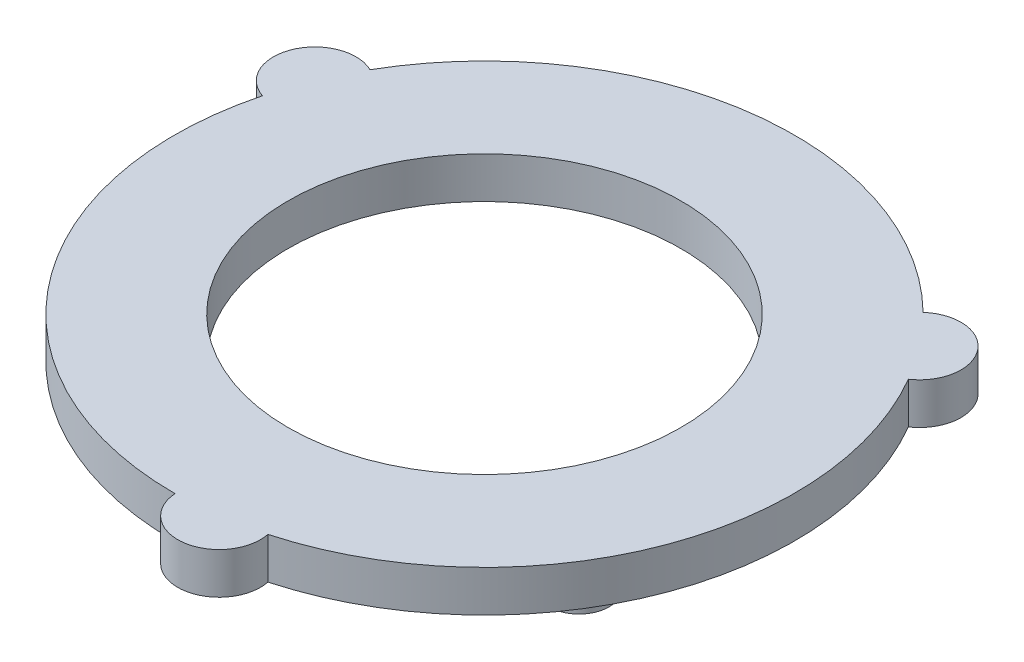
ISO-10303-21;
HEADER;
FILE_DESCRIPTION(('STEP AP214'),'2;1');
FILE_NAME('part.step','',(''),(''),'','','');
FILE_SCHEMA(('AUTOMOTIVE_DESIGN { 1 0 10303 214 1 1 1 1 }'));
ENDSEC;
DATA;
#1=APPLICATION_CONTEXT('core data for automotive mechanical design processes');
#2=APPLICATION_PROTOCOL_DEFINITION('international standard','automotive_design',2000,#1);
#3=PRODUCT_CONTEXT('',#1,'mechanical');
#4=PRODUCT('Part','Part','',(#3));
#5=PRODUCT_RELATED_PRODUCT_CATEGORY('part','',(#4));
#6=PRODUCT_DEFINITION_FORMATION('','',#4);
#7=PRODUCT_DEFINITION_CONTEXT('part definition',#1,'design');
#8=PRODUCT_DEFINITION('design','',#6,#7);
#9=PRODUCT_DEFINITION_SHAPE('','',#8);
#10=(LENGTH_UNIT() NAMED_UNIT(*) SI_UNIT(.MILLI.,.METRE.));
#11=(NAMED_UNIT(*) PLANE_ANGLE_UNIT() SI_UNIT($,.RADIAN.));
#12=(NAMED_UNIT(*) SI_UNIT($,.STERADIAN.) SOLID_ANGLE_UNIT());
#13=UNCERTAINTY_MEASURE_WITH_UNIT(LENGTH_MEASURE(1.E-05),#10,'distance_accuracy_value','');
#14=(GEOMETRIC_REPRESENTATION_CONTEXT(3) GLOBAL_UNCERTAINTY_ASSIGNED_CONTEXT((#13)) GLOBAL_UNIT_ASSIGNED_CONTEXT((#10,
#11,#12)) REPRESENTATION_CONTEXT('',''));
#15=CARTESIAN_POINT('',(0.,0.,0.));
#16=DIRECTION('',(0.,0.,1.));
#17=DIRECTION('',(1.,0.,0.));
#18=AXIS2_PLACEMENT_3D('',#15,#16,#17);
#19=CARTESIAN_POINT('',(0.,4.,0.));
#20=DIRECTION('',(0.,-1.,0.));
#21=DIRECTION('',(0.,0.,-1.));
#22=AXIS2_PLACEMENT_3D('',#19,#20,#21);
#23=CYLINDRICAL_SURFACE('',#22,30.);
#24=CARTESIAN_POINT('',(0.,0.,0.));
#25=DIRECTION('',(0.,1.,0.));
#26=DIRECTION('',(0.,0.,1.));
#27=AXIS2_PLACEMENT_3D('',#24,#25,#26);
#28=CIRCLE('',#27,30.);
#29=CARTESIAN_POINT('',(-29.032716116672,0.,-7.55654649219703));
#30=VERTEX_POINT('',#29);
#31=CARTESIAN_POINT('',(0.063202070182955,0.,29.9999334248982));
#32=VERTEX_POINT('',#31);
#33=EDGE_CURVE('E96',#30,#32,#28,.T.);
#34=ORIENTED_EDGE('',*,*,#33,.T.);
#35=DIRECTION('',(0.,1.,0.));
#36=VECTOR('',#35,1.);
#37=CARTESIAN_POINT('',(0.0632020701829524,2.,29.9999334248982));
#38=LINE('',#37,#36);
#39=CARTESIAN_POINT('',(0.063202070182955,4.,29.9999334248982));
#40=VERTEX_POINT('',#39);
#41=EDGE_CURVE('E60',#32,#40,#38,.T.);
#42=ORIENTED_EDGE('',*,*,#41,.T.);
#43=CARTESIAN_POINT('',(0.,4.,0.));
#44=DIRECTION('',(0.,1.,0.));
#45=DIRECTION('',(0.,0.,1.));
#46=AXIS2_PLACEMENT_3D('',#43,#44,#45);
#47=CIRCLE('',#46,30.);
#48=CARTESIAN_POINT('',(-29.032716116672,4.,-7.55654649219703));
#49=VERTEX_POINT('',#48);
#50=EDGE_CURVE('E11',#49,#40,#47,.T.);
#51=ORIENTED_EDGE('',*,*,#50,.F.);
#52=DIRECTION('',(0.,1.,0.));
#53=VECTOR('',#52,1.);
#54=CARTESIAN_POINT('',(-29.032716116672,2.,-7.55654649219703));
#55=LINE('',#54,#53);
#56=EDGE_CURVE('E126',#49,#30,#55,.F.);
#57=ORIENTED_EDGE('',*,*,#56,.T.);
#58=EDGE_LOOP('',(#34,#42,#51,#57));
#59=FACE_BOUND('',#58,.T.);
#60=ADVANCED_FACE('F35',(#59),#23,.T.);
#61=CARTESIAN_POINT('',(7.97219683121726,4.,28.9213429439978));
#62=VERTEX_POINT('',#61);
#63=CARTESIAN_POINT('',(25.9491034227124,4.,-15.0547013107991));
#64=VERTEX_POINT('',#63);
#65=EDGE_CURVE('E44',#62,#64,#47,.T.);
#66=ORIENTED_EDGE('',*,*,#65,.F.);
#67=DIRECTION('',(0.,1.,0.));
#68=VECTOR('',#67,1.);
#69=CARTESIAN_POINT('',(7.97219683121726,2.,28.9213429439978));
#70=LINE('',#69,#68);
#71=CARTESIAN_POINT('',(7.97219683121726,0.,28.9213429439978));
#72=VERTEX_POINT('',#71);
#73=EDGE_CURVE('E99',#62,#72,#70,.F.);
#74=ORIENTED_EDGE('',*,*,#73,.T.);
#75=CARTESIAN_POINT('',(25.9491034227124,0.,-15.054701310799));
#76=VERTEX_POINT('',#75);
#77=EDGE_CURVE('E90',#72,#76,#28,.T.);
#78=ORIENTED_EDGE('',*,*,#77,.T.);
#79=DIRECTION('',(0.,1.,0.));
#80=VECTOR('',#79,1.);
#81=CARTESIAN_POINT('',(25.9491034227124,2.,-15.0547013107991));
#82=LINE('',#81,#80);
#83=EDGE_CURVE('E118',#76,#64,#82,.T.);
#84=ORIENTED_EDGE('',*,*,#83,.T.);
#85=EDGE_LOOP('',(#66,#74,#78,#84));
#86=FACE_BOUND('',#85,.T.);
#87=ADVANCED_FACE('F100',(#86),#23,.T.);
#88=CARTESIAN_POINT('',(0.,4.,0.));
#89=DIRECTION('',(0.,1.,0.));
#90=DIRECTION('',(0.,0.,1.));
#91=AXIS2_PLACEMENT_3D('',#88,#89,#90);
#92=PLANE('',#91);
#93=ORIENTED_EDGE('',*,*,#50,.T.);
#94=CARTESIAN_POINT('',(4.05373262963005,4.,29.7248591547114));
#95=DIRECTION('',(0.,1.,0.));
#96=DIRECTION('',(0.,0.,1.));
#97=AXIS2_PLACEMENT_3D('',#94,#95,#96);
#98=CIRCLE('',#97,4.);
#99=EDGE_CURVE('E106',#40,#62,#98,.T.);
#100=ORIENTED_EDGE('',*,*,#99,.T.);
#101=ORIENTED_EDGE('',*,*,#65,.T.);
#102=CARTESIAN_POINT('',(23.7156168370815,4.,-18.3730650147662));
#103=DIRECTION('',(0.,1.,0.));
#104=DIRECTION('',(0.,0.,1.));
#105=AXIS2_PLACEMENT_3D('',#102,#103,#104);
#106=CIRCLE('',#105,4.);
#107=CARTESIAN_POINT('',(21.0605192854557,4.,-21.3647964518024));
#108=VERTEX_POINT('',#107);
#109=EDGE_CURVE('E111',#64,#108,#106,.T.);
#110=ORIENTED_EDGE('',*,*,#109,.T.);
#111=CARTESIAN_POINT('',(-26.0123054928942,4.,-14.9452321141007));
#112=VERTEX_POINT('',#111);
#113=EDGE_CURVE('E46',#108,#112,#47,.T.);
#114=ORIENTED_EDGE('',*,*,#113,.T.);
#115=CARTESIAN_POINT('',(-27.7693494667094,4.,-11.3517941399484));
#116=DIRECTION('',(0.,1.,0.));
#117=DIRECTION('',(0.,0.,1.));
#118=AXIS2_PLACEMENT_3D('',#115,#116,#117);
#119=CIRCLE('',#118,4.);
#120=EDGE_CURVE('E120',#112,#49,#119,.T.);
#121=ORIENTED_EDGE('',*,*,#120,.T.);
#122=EDGE_LOOP('',(#93,#100,#101,#110,#114,#121));
#123=FACE_BOUND('',#122,.T.);
#124=CARTESIAN_POINT('',(0.,4.,0.));
#125=DIRECTION('',(0.,1.,0.));
#126=DIRECTION('',(0.,0.,1.));
#127=AXIS2_PLACEMENT_3D('',#124,#125,#126);
#128=CIRCLE('',#127,19.);
#129=CARTESIAN_POINT('',(0.,4.,19.));
#130=VERTEX_POINT('',#129);
#131=EDGE_CURVE('E143',#130,#130,#128,.T.);
#132=ORIENTED_EDGE('',*,*,#131,.F.);
#133=EDGE_LOOP('',(#132));
#134=FACE_BOUND('',#133,.T.);
#135=ADVANCED_FACE('F178',(#123,#134),#92,.T.);
#136=ORIENTED_EDGE('',*,*,#113,.F.);
#137=DIRECTION('',(0.,1.,0.));
#138=VECTOR('',#137,1.);
#139=CARTESIAN_POINT('',(21.0605192854557,2.,-21.3647964518024));
#140=LINE('',#139,#138);
#141=CARTESIAN_POINT('',(21.0605192854557,0.,-21.3647964518024));
#142=VERTEX_POINT('',#141);
#143=EDGE_CURVE('E115',#108,#142,#140,.F.);
#144=ORIENTED_EDGE('',*,*,#143,.T.);
#145=CARTESIAN_POINT('',(-26.0123054928942,0.,-14.9452321141007));
#146=VERTEX_POINT('',#145);
#147=EDGE_CURVE('E97',#142,#146,#28,.T.);
#148=ORIENTED_EDGE('',*,*,#147,.T.);
#149=DIRECTION('',(0.,1.,0.));
#150=VECTOR('',#149,1.);
#151=CARTESIAN_POINT('',(-26.0123054928942,2.,-14.9452321141007));
#152=LINE('',#151,#150);
#153=EDGE_CURVE('E129',#146,#112,#152,.T.);
#154=ORIENTED_EDGE('',*,*,#153,.T.);
#155=EDGE_LOOP('',(#136,#144,#148,#154));
#156=FACE_BOUND('',#155,.T.);
#157=ADVANCED_FACE('F174',(#156),#23,.T.);
#158=CARTESIAN_POINT('',(0.,4.,0.));
#159=DIRECTION('',(0.,-1.,0.));
#160=DIRECTION('',(0.,0.,-1.));
#161=AXIS2_PLACEMENT_3D('',#158,#159,#160);
#162=CYLINDRICAL_SURFACE('',#161,19.);
#163=ORIENTED_EDGE('',*,*,#131,.T.);
#164=EDGE_LOOP('',(#163));
#165=FACE_BOUND('',#164,.T.);
#166=CARTESIAN_POINT('',(0.,0.,0.));
#167=DIRECTION('',(0.,1.,0.));
#168=DIRECTION('',(0.,0.,1.));
#169=AXIS2_PLACEMENT_3D('',#166,#167,#168);
#170=CIRCLE('',#169,19.);
#171=CARTESIAN_POINT('',(0.,0.,19.));
#172=VERTEX_POINT('',#171);
#173=EDGE_CURVE('E145',#172,#172,#170,.T.);
#174=ORIENTED_EDGE('',*,*,#173,.F.);
#175=EDGE_LOOP('',(#174));
#176=FACE_BOUND('',#175,.T.);
#177=ADVANCED_FACE('F181',(#165,#176),#162,.F.);
#178=CARTESIAN_POINT('',(0.,0.,0.));
#179=DIRECTION('',(0.,1.,0.));
#180=DIRECTION('',(0.,0.,1.));
#181=AXIS2_PLACEMENT_3D('',#178,#179,#180);
#182=PLANE('',#181);
#183=CARTESIAN_POINT('',(1.60090602130669E-12,0.,-24.9999999999991));
#184=DIRECTION('',(0.,1.,0.));
#185=DIRECTION('',(0.,0.,1.));
#186=AXIS2_PLACEMENT_3D('',#183,#184,#185);
#187=CIRCLE('',#186,2.9);
#188=CARTESIAN_POINT('',(1.60090602130669E-12,0.,-22.0999999999991));
#189=VERTEX_POINT('',#188);
#190=EDGE_CURVE('E39',#189,#189,#187,.T.);
#191=ORIENTED_EDGE('',*,*,#190,.T.);
#192=EDGE_LOOP('',(#191));
#193=FACE_BOUND('',#192,.T.);
#194=CARTESIAN_POINT('',(21.650635094611,0.,12.5000000000018));
#195=DIRECTION('',(0.,1.,0.));
#196=DIRECTION('',(0.,0.,1.));
#197=AXIS2_PLACEMENT_3D('',#194,#195,#196);
#198=CIRCLE('',#197,2.9);
#199=CARTESIAN_POINT('',(21.650635094611,0.,15.4000000000018));
#200=VERTEX_POINT('',#199);
#201=EDGE_CURVE('E138',#200,#200,#198,.T.);
#202=ORIENTED_EDGE('',*,*,#201,.T.);
#203=EDGE_LOOP('',(#202));
#204=FACE_BOUND('',#203,.T.);
#205=CARTESIAN_POINT('',(-21.650635094611,0.,12.5));
#206=DIRECTION('',(0.,1.,0.));
#207=DIRECTION('',(0.,0.,1.));
#208=AXIS2_PLACEMENT_3D('',#205,#206,#207);
#209=CIRCLE('',#208,2.9);
#210=CARTESIAN_POINT('',(-21.650635094611,0.,15.4));
#211=VERTEX_POINT('',#210);
#212=EDGE_CURVE('E142',#211,#211,#209,.T.);
#213=ORIENTED_EDGE('',*,*,#212,.T.);
#214=EDGE_LOOP('',(#213));
#215=FACE_BOUND('',#214,.T.);
#216=ORIENTED_EDGE('',*,*,#173,.T.);
#217=EDGE_LOOP('',(#216));
#218=FACE_BOUND('',#217,.T.);
#219=ORIENTED_EDGE('',*,*,#77,.F.);
#220=CARTESIAN_POINT('',(4.05373262963005,0.,29.7248591547114));
#221=DIRECTION('',(0.,1.,0.));
#222=DIRECTION('',(0.,0.,1.));
#223=AXIS2_PLACEMENT_3D('',#220,#221,#222);
#224=CIRCLE('',#223,4.);
#225=EDGE_CURVE('E92',#72,#32,#224,.F.);
#226=ORIENTED_EDGE('',*,*,#225,.T.);
#227=ORIENTED_EDGE('',*,*,#33,.F.);
#228=CARTESIAN_POINT('',(-27.7693494667094,0.,-11.3517941399484));
#229=DIRECTION('',(0.,1.,0.));
#230=DIRECTION('',(0.,0.,1.));
#231=AXIS2_PLACEMENT_3D('',#228,#229,#230);
#232=CIRCLE('',#231,4.);
#233=EDGE_CURVE('E123',#30,#146,#232,.F.);
#234=ORIENTED_EDGE('',*,*,#233,.T.);
#235=ORIENTED_EDGE('',*,*,#147,.F.);
#236=CARTESIAN_POINT('',(23.7156168370815,0.,-18.3730650147662));
#237=DIRECTION('',(0.,1.,0.));
#238=DIRECTION('',(0.,0.,1.));
#239=AXIS2_PLACEMENT_3D('',#236,#237,#238);
#240=CIRCLE('',#239,4.);
#241=EDGE_CURVE('E94',#142,#76,#240,.F.);
#242=ORIENTED_EDGE('',*,*,#241,.T.);
#243=EDGE_LOOP('',(#219,#226,#227,#234,#235,#242));
#244=FACE_BOUND('',#243,.T.);
#245=ADVANCED_FACE('F37',(#193,#204,#215,#218,#244),#182,.F.);
#246=CARTESIAN_POINT('',(-21.650635094611,-2.,12.5));
#247=DIRECTION('',(0.,-1.,0.));
#248=DIRECTION('',(0.,0.,-1.));
#249=AXIS2_PLACEMENT_3D('',#246,#247,#248);
#250=PLANE('',#249);
#251=CARTESIAN_POINT('',(-21.650635094611,-2.,12.5));
#252=DIRECTION('',(0.,-1.,0.));
#253=DIRECTION('',(0.,0.,-1.));
#254=AXIS2_PLACEMENT_3D('',#251,#252,#253);
#255=CIRCLE('',#254,2.9);
#256=CARTESIAN_POINT('',(-21.650635094611,-2.,9.60000000000001));
#257=VERTEX_POINT('',#256);
#258=EDGE_CURVE('E139',#257,#257,#255,.T.);
#259=ORIENTED_EDGE('',*,*,#258,.T.);
#260=EDGE_LOOP('',(#259));
#261=FACE_BOUND('',#260,.T.);
#262=ADVANCED_FACE('F230',(#261),#250,.T.);
#263=CARTESIAN_POINT('',(-21.650635094611,12.2024386617639,12.5));
#264=DIRECTION('',(0.,-1.,0.));
#265=DIRECTION('',(0.,0.,-1.));
#266=AXIS2_PLACEMENT_3D('',#263,#264,#265);
#267=CYLINDRICAL_SURFACE('',#266,2.9);
#268=ORIENTED_EDGE('',*,*,#258,.F.);
#269=EDGE_LOOP('',(#268));
#270=FACE_BOUND('',#269,.T.);
#271=ORIENTED_EDGE('',*,*,#212,.F.);
#272=EDGE_LOOP('',(#271));
#273=FACE_BOUND('',#272,.T.);
#274=ADVANCED_FACE('F168',(#270,#273),#267,.T.);
#275=CARTESIAN_POINT('',(21.650635094611,-2.,12.5000000000018));
#276=DIRECTION('',(0.,-1.,0.));
#277=DIRECTION('',(0.,0.,-1.));
#278=AXIS2_PLACEMENT_3D('',#275,#276,#277);
#279=PLANE('',#278);
#280=CARTESIAN_POINT('',(21.650635094611,-2.,12.5000000000018));
#281=DIRECTION('',(0.,-1.,0.));
#282=DIRECTION('',(0.,0.,-1.));
#283=AXIS2_PLACEMENT_3D('',#280,#281,#282);
#284=CIRCLE('',#283,2.9);
#285=CARTESIAN_POINT('',(21.650635094611,-2.,9.60000000000185));
#286=VERTEX_POINT('',#285);
#287=EDGE_CURVE('E135',#286,#286,#284,.T.);
#288=ORIENTED_EDGE('',*,*,#287,.T.);
#289=EDGE_LOOP('',(#288));
#290=FACE_BOUND('',#289,.T.);
#291=ADVANCED_FACE('F158',(#290),#279,.T.);
#292=CARTESIAN_POINT('',(21.650635094611,12.2024386617639,12.5000000000018));
#293=DIRECTION('',(0.,-1.,0.));
#294=DIRECTION('',(0.,0.,-1.));
#295=AXIS2_PLACEMENT_3D('',#292,#293,#294);
#296=CYLINDRICAL_SURFACE('',#295,2.9);
#297=ORIENTED_EDGE('',*,*,#287,.F.);
#298=EDGE_LOOP('',(#297));
#299=FACE_BOUND('',#298,.T.);
#300=ORIENTED_EDGE('',*,*,#201,.F.);
#301=EDGE_LOOP('',(#300));
#302=FACE_BOUND('',#301,.T.);
#303=ADVANCED_FACE('F155',(#299,#302),#296,.T.);
#304=CARTESIAN_POINT('',(1.60090602130669E-12,-2.,-24.9999999999991));
#305=DIRECTION('',(0.,-1.,0.));
#306=DIRECTION('',(0.,0.,-1.));
#307=AXIS2_PLACEMENT_3D('',#304,#305,#306);
#308=PLANE('',#307);
#309=CARTESIAN_POINT('',(1.60090602130669E-12,-2.,-24.9999999999991));
#310=DIRECTION('',(0.,-1.,0.));
#311=DIRECTION('',(0.,0.,-1.));
#312=AXIS2_PLACEMENT_3D('',#309,#310,#311);
#313=CIRCLE('',#312,2.9);
#314=CARTESIAN_POINT('',(1.60090602130669E-12,-2.,-27.8999999999991));
#315=VERTEX_POINT('',#314);
#316=EDGE_CURVE('E132',#315,#315,#313,.T.);
#317=ORIENTED_EDGE('',*,*,#316,.T.);
#318=EDGE_LOOP('',(#317));
#319=FACE_BOUND('',#318,.T.);
#320=ADVANCED_FACE('F157',(#319),#308,.T.);
#321=CARTESIAN_POINT('',(1.60090602130669E-12,12.2024386617639,-24.9999999999991));
#322=DIRECTION('',(0.,-1.,0.));
#323=DIRECTION('',(0.,0.,-1.));
#324=AXIS2_PLACEMENT_3D('',#321,#322,#323);
#325=CYLINDRICAL_SURFACE('',#324,2.9);
#326=ORIENTED_EDGE('',*,*,#316,.F.);
#327=EDGE_LOOP('',(#326));
#328=FACE_BOUND('',#327,.T.);
#329=ORIENTED_EDGE('',*,*,#190,.F.);
#330=EDGE_LOOP('',(#329));
#331=FACE_BOUND('',#330,.T.);
#332=ADVANCED_FACE('F165',(#328,#331),#325,.T.);
#333=CARTESIAN_POINT('',(-27.7693494667094,-11.3137084989848,-11.3517941399484));
#334=DIRECTION('',(0.,1.,0.));
#335=DIRECTION('',(0.,0.,1.));
#336=AXIS2_PLACEMENT_3D('',#333,#334,#335);
#337=CYLINDRICAL_SURFACE('',#336,4.);
#338=ORIENTED_EDGE('',*,*,#153,.F.);
#339=ORIENTED_EDGE('',*,*,#233,.F.);
#340=ORIENTED_EDGE('',*,*,#56,.F.);
#341=ORIENTED_EDGE('',*,*,#120,.F.);
#342=EDGE_LOOP('',(#338,#339,#340,#341));
#343=FACE_BOUND('',#342,.T.);
#344=ADVANCED_FACE('F200',(#343),#337,.T.);
#345=CARTESIAN_POINT('',(23.7156168370815,-11.3137084989848,-18.3730650147662));
#346=DIRECTION('',(0.,1.,0.));
#347=DIRECTION('',(0.,0.,1.));
#348=AXIS2_PLACEMENT_3D('',#345,#346,#347);
#349=CYLINDRICAL_SURFACE('',#348,4.);
#350=ORIENTED_EDGE('',*,*,#83,.F.);
#351=ORIENTED_EDGE('',*,*,#241,.F.);
#352=ORIENTED_EDGE('',*,*,#143,.F.);
#353=ORIENTED_EDGE('',*,*,#109,.F.);
#354=EDGE_LOOP('',(#350,#351,#352,#353));
#355=FACE_BOUND('',#354,.T.);
#356=ADVANCED_FACE('F195',(#355),#349,.T.);
#357=CARTESIAN_POINT('',(4.05373262963005,-11.3137084989848,29.7248591547114));
#358=DIRECTION('',(0.,1.,0.));
#359=DIRECTION('',(0.,0.,1.));
#360=AXIS2_PLACEMENT_3D('',#357,#358,#359);
#361=CYLINDRICAL_SURFACE('',#360,4.);
#362=ORIENTED_EDGE('',*,*,#41,.F.);
#363=ORIENTED_EDGE('',*,*,#225,.F.);
#364=ORIENTED_EDGE('',*,*,#73,.F.);
#365=ORIENTED_EDGE('',*,*,#99,.F.);
#366=EDGE_LOOP('',(#362,#363,#364,#365));
#367=FACE_BOUND('',#366,.T.);
#368=ADVANCED_FACE('F105',(#367),#361,.T.);
#369=CLOSED_SHELL('',(#60,#87,#135,#157,#177,#245,#262,#274,#291,#303,#320,#332,#344,#356,#368));
#370=MANIFOLD_SOLID_BREP('B2',#369);
#371=ADVANCED_BREP_SHAPE_REPRESENTATION('',(#18,#370),#14);
#372=SHAPE_DEFINITION_REPRESENTATION(#9,#371);
ENDSEC;
END-ISO-10303-21;
